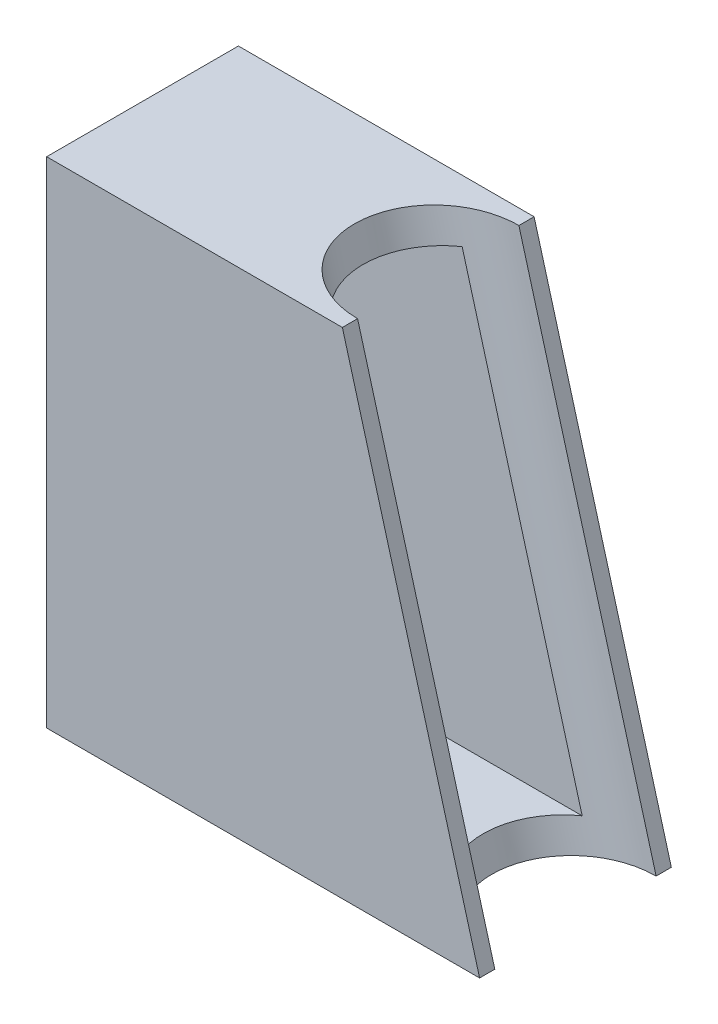
ISO-10303-21;
HEADER;
FILE_DESCRIPTION(('STEP AP214'),'2;1');
FILE_NAME('part.step','',(''),(''),'','','');
FILE_SCHEMA(('AUTOMOTIVE_DESIGN { 1 0 10303 214 1 1 1 1 }'));
ENDSEC;
DATA;
#1=APPLICATION_CONTEXT('core data for automotive mechanical design processes');
#2=APPLICATION_PROTOCOL_DEFINITION('international standard','automotive_design',2000,#1);
#3=PRODUCT_CONTEXT('',#1,'mechanical');
#4=PRODUCT('Part','Part','',(#3));
#5=PRODUCT_RELATED_PRODUCT_CATEGORY('part','',(#4));
#6=PRODUCT_DEFINITION_FORMATION('','',#4);
#7=PRODUCT_DEFINITION_CONTEXT('part definition',#1,'design');
#8=PRODUCT_DEFINITION('design','',#6,#7);
#9=PRODUCT_DEFINITION_SHAPE('','',#8);
#10=(LENGTH_UNIT() NAMED_UNIT(*) SI_UNIT(.MILLI.,.METRE.));
#11=(NAMED_UNIT(*) PLANE_ANGLE_UNIT() SI_UNIT($,.RADIAN.));
#12=(NAMED_UNIT(*) SI_UNIT($,.STERADIAN.) SOLID_ANGLE_UNIT());
#13=UNCERTAINTY_MEASURE_WITH_UNIT(LENGTH_MEASURE(1.E-05),#10,'distance_accuracy_value','');
#14=(GEOMETRIC_REPRESENTATION_CONTEXT(3) GLOBAL_UNCERTAINTY_ASSIGNED_CONTEXT((#13)) GLOBAL_UNIT_ASSIGNED_CONTEXT((#10,
#11,#12)) REPRESENTATION_CONTEXT('',''));
#15=CARTESIAN_POINT('',(0.,0.,0.));
#16=DIRECTION('',(0.,0.,1.));
#17=DIRECTION('',(1.,0.,0.));
#18=AXIS2_PLACEMENT_3D('',#15,#16,#17);
#19=CARTESIAN_POINT('',(-5.55237226107326,-65.915590084916,31.));
#20=DIRECTION('',(-0.963624069203044,-0.267261394991058,0.));
#21=DIRECTION('',(0.267261394991058,-0.963624069203044,0.));
#22=AXIS2_PLACEMENT_3D('',#19,#20,#21);
#23=PLANE('',#22);
#24=DIRECTION('',(0.,0.,-1.));
#25=VECTOR('',#24,1.);
#26=CARTESIAN_POINT('',(-5.55237226107326,-65.915590084916,31.));
#27=LINE('',#26,#25);
#28=CARTESIAN_POINT('',(-5.55237226107326,-65.915590084916,31.));
#29=VERTEX_POINT('',#28);
#30=CARTESIAN_POINT('',(-5.55237226107325,-65.915590084916,28.5414448701443));
#31=VERTEX_POINT('',#30);
#32=EDGE_CURVE('E122',#29,#31,#27,.T.);
#33=ORIENTED_EDGE('',*,*,#32,.T.);
#34=DIRECTION('',(-0.267261394991058,0.963624069203044,0.));
#35=VECTOR('',#34,1.);
#36=CARTESIAN_POINT('',(-5.55237226107325,-65.915590084916,28.5414448701443));
#37=LINE('',#36,#35);
#38=CARTESIAN_POINT('',(-27.7403937962426,14.084409915084,28.5414448701443));
#39=VERTEX_POINT('',#38);
#40=EDGE_CURVE('E110',#31,#39,#37,.T.);
#41=ORIENTED_EDGE('',*,*,#40,.T.);
#42=DIRECTION('',(0.,0.,1.));
#43=VECTOR('',#42,1.);
#44=CARTESIAN_POINT('',(-27.7403937962426,14.084409915084,31.));
#45=LINE('',#44,#43);
#46=CARTESIAN_POINT('',(-27.7403937962426,14.084409915084,31.));
#47=VERTEX_POINT('',#46);
#48=EDGE_CURVE('E180',#39,#47,#45,.T.);
#49=ORIENTED_EDGE('',*,*,#48,.T.);
#50=DIRECTION('',(-0.267261394991058,0.963624069203044,0.));
#51=VECTOR('',#50,1.);
#52=CARTESIAN_POINT('',(-5.55237226107326,-65.915590084916,31.));
#53=LINE('',#52,#51);
#54=EDGE_CURVE('E128',#29,#47,#53,.T.);
#55=ORIENTED_EDGE('',*,*,#54,.F.);
#56=EDGE_LOOP('',(#33,#41,#49,#55));
#57=FACE_BOUND('',#56,.T.);
#58=ADVANCED_FACE('F36',(#57),#23,.F.);
#59=CARTESIAN_POINT('',(-5.55237226107326,-65.915590084916,31.));
#60=DIRECTION('',(0.,1.,0.));
#61=DIRECTION('',(-1.,0.,0.));
#62=AXIS2_PLACEMENT_3D('',#59,#60,#61);
#63=PLANE('',#62);
#64=CARTESIAN_POINT('',(-60.5523722610733,-65.915590084916,14.6496389415134));
#65=DIRECTION('',(0.,1.,0.));
#66=DIRECTION('',(-1.,0.,0.));
#67=AXIS2_PLACEMENT_3D('',#64,#65,#66);
#68=CIRCLE('',#67,6.);
#69=CARTESIAN_POINT('',(-66.5523722610733,-65.915590084916,14.6496389415134));
#70=VERTEX_POINT('',#69);
#71=EDGE_CURVE('E168',#70,#70,#68,.T.);
#72=ORIENTED_EDGE('',*,*,#71,.T.);
#73=EDGE_LOOP('',(#72));
#74=FACE_BOUND('',#73,.T.);
#75=CARTESIAN_POINT('',(-5.55237226107325,-65.915590084916,2.45855512985571));
#76=VERTEX_POINT('',#75);
#77=CARTESIAN_POINT('',(-5.55237226107326,-65.915590084916,0.));
#78=VERTEX_POINT('',#77);
#79=EDGE_CURVE('E124',#76,#78,#27,.T.);
#80=ORIENTED_EDGE('',*,*,#79,.F.);
#81=CARTESIAN_POINT('',(-5.55237226107324,-65.915590084916,15.5));
#82=DIRECTION('',(0.,1.,0.));
#83=DIRECTION('',(-1.,0.,0.));
#84=AXIS2_PLACEMENT_3D('',#81,#82,#83);
#85=ELLIPSE('',#84,13.5337475338594,13.0414448701443);
#86=EDGE_CURVE('E113',#76,#31,#85,.T.);
#87=ORIENTED_EDGE('',*,*,#86,.T.);
#88=ORIENTED_EDGE('',*,*,#32,.F.);
#89=DIRECTION('',(1.,0.,0.));
#90=VECTOR('',#89,1.);
#91=CARTESIAN_POINT('',(-5.55237226107326,-65.915590084916,31.));
#92=LINE('',#91,#90);
#93=CARTESIAN_POINT('',(-75.5523722610733,-65.915590084916,31.));
#94=VERTEX_POINT('',#93);
#95=EDGE_CURVE('E139',#94,#29,#92,.T.);
#96=ORIENTED_EDGE('',*,*,#95,.F.);
#97=DIRECTION('',(0.,0.,-1.));
#98=VECTOR('',#97,1.);
#99=CARTESIAN_POINT('',(-75.5523722610733,-65.915590084916,31.));
#100=LINE('',#99,#98);
#101=CARTESIAN_POINT('',(-75.5523722610733,-65.915590084916,0.));
#102=VERTEX_POINT('',#101);
#103=EDGE_CURVE('E132',#94,#102,#100,.T.);
#104=ORIENTED_EDGE('',*,*,#103,.T.);
#105=DIRECTION('',(1.,0.,0.));
#106=VECTOR('',#105,1.);
#107=CARTESIAN_POINT('',(-5.55237226107326,-65.915590084916,0.));
#108=LINE('',#107,#106);
#109=EDGE_CURVE('E143',#102,#78,#108,.T.);
#110=ORIENTED_EDGE('',*,*,#109,.T.);
#111=EDGE_LOOP('',(#80,#87,#88,#96,#104,#110));
#112=FACE_BOUND('',#111,.T.);
#113=ADVANCED_FACE('F38',(#74,#112),#63,.F.);
#114=CARTESIAN_POINT('',(-27.7403937962426,14.084409915084,0.));
#115=VERTEX_POINT('',#114);
#116=CARTESIAN_POINT('',(-27.7403937962426,14.084409915084,2.45855512985571));
#117=VERTEX_POINT('',#116);
#118=EDGE_CURVE('E177',#115,#117,#45,.T.);
#119=ORIENTED_EDGE('',*,*,#118,.T.);
#120=DIRECTION('',(-0.267261394991058,0.963624069203044,0.));
#121=VECTOR('',#120,1.);
#122=CARTESIAN_POINT('',(-5.55237226107325,-65.915590084916,2.45855512985571));
#123=LINE('',#122,#121);
#124=EDGE_CURVE('E59',#117,#76,#123,.F.);
#125=ORIENTED_EDGE('',*,*,#124,.T.);
#126=ORIENTED_EDGE('',*,*,#79,.T.);
#127=DIRECTION('',(-0.267261394991058,0.963624069203044,0.));
#128=VECTOR('',#127,1.);
#129=CARTESIAN_POINT('',(-5.55237226107326,-65.915590084916,0.));
#130=LINE('',#129,#128);
#131=EDGE_CURVE('E140',#78,#115,#130,.T.);
#132=ORIENTED_EDGE('',*,*,#131,.T.);
#133=EDGE_LOOP('',(#119,#125,#126,#132));
#134=FACE_BOUND('',#133,.T.);
#135=ADVANCED_FACE('F192',(#134),#23,.F.);
#136=CARTESIAN_POINT('',(-75.5523722610733,34.084409915084,31.));
#137=DIRECTION('',(1.,0.,0.));
#138=DIRECTION('',(0.,0.,-1.));
#139=AXIS2_PLACEMENT_3D('',#136,#137,#138);
#140=PLANE('',#139);
#141=DIRECTION('',(0.,0.,1.));
#142=VECTOR('',#141,1.);
#143=CARTESIAN_POINT('',(-75.5523722610733,-60.915590084916,5.00000000000001));
#144=LINE('',#143,#142);
#145=CARTESIAN_POINT('',(-75.5523722610733,-60.915590084916,5.00000000000001));
#146=VERTEX_POINT('',#145);
#147=CARTESIAN_POINT('',(-75.5523722610733,-60.915590084916,26.));
#148=VERTEX_POINT('',#147);
#149=EDGE_CURVE('E162',#146,#148,#144,.T.);
#150=ORIENTED_EDGE('',*,*,#149,.F.);
#151=DIRECTION('',(0.,-1.,0.));
#152=VECTOR('',#151,1.);
#153=CARTESIAN_POINT('',(-75.5523722610733,9.08440991508402,5.));
#154=LINE('',#153,#152);
#155=CARTESIAN_POINT('',(-75.5523722610733,9.08440991508402,5.));
#156=VERTEX_POINT('',#155);
#157=EDGE_CURVE('E165',#156,#146,#154,.T.);
#158=ORIENTED_EDGE('',*,*,#157,.F.);
#159=DIRECTION('',(0.,0.,-1.));
#160=VECTOR('',#159,1.);
#161=CARTESIAN_POINT('',(-75.5523722610733,9.08440991508402,5.));
#162=LINE('',#161,#160);
#163=CARTESIAN_POINT('',(-75.5523722610733,9.08440991508402,26.));
#164=VERTEX_POINT('',#163);
#165=EDGE_CURVE('E152',#164,#156,#162,.T.);
#166=ORIENTED_EDGE('',*,*,#165,.F.);
#167=DIRECTION('',(0.,1.,0.));
#168=VECTOR('',#167,1.);
#169=CARTESIAN_POINT('',(-75.5523722610733,9.08440991508402,26.));
#170=LINE('',#169,#168);
#171=EDGE_CURVE('E159',#148,#164,#170,.T.);
#172=ORIENTED_EDGE('',*,*,#171,.F.);
#173=EDGE_LOOP('',(#150,#158,#166,#172));
#174=FACE_BOUND('',#173,.T.);
#175=DIRECTION('',(0.,-1.,0.));
#176=VECTOR('',#175,1.);
#177=CARTESIAN_POINT('',(-75.5523722610733,34.084409915084,31.));
#178=LINE('',#177,#176);
#179=CARTESIAN_POINT('',(-75.5523722610733,14.084409915084,31.));
#180=VERTEX_POINT('',#179);
#181=EDGE_CURVE('E136',#180,#94,#178,.T.);
#182=ORIENTED_EDGE('',*,*,#181,.F.);
#183=DIRECTION('',(0.,0.,1.));
#184=VECTOR('',#183,1.);
#185=CARTESIAN_POINT('',(-75.5523722610733,14.084409915084,-21.0430808616771));
#186=LINE('',#185,#184);
#187=CARTESIAN_POINT('',(-75.5523722610733,14.084409915084,0.));
#188=VERTEX_POINT('',#187);
#189=EDGE_CURVE('E181',#188,#180,#186,.T.);
#190=ORIENTED_EDGE('',*,*,#189,.F.);
#191=DIRECTION('',(0.,-1.,0.));
#192=VECTOR('',#191,1.);
#193=CARTESIAN_POINT('',(-75.5523722610733,34.084409915084,0.));
#194=LINE('',#193,#192);
#195=EDGE_CURVE('E137',#188,#102,#194,.T.);
#196=ORIENTED_EDGE('',*,*,#195,.T.);
#197=ORIENTED_EDGE('',*,*,#103,.F.);
#198=EDGE_LOOP('',(#182,#190,#196,#197));
#199=FACE_BOUND('',#198,.T.);
#200=ADVANCED_FACE('F204',(#174,#199),#140,.F.);
#201=CARTESIAN_POINT('',(0.,0.,31.));
#202=DIRECTION('',(0.,0.,1.));
#203=DIRECTION('',(1.,0.,0.));
#204=AXIS2_PLACEMENT_3D('',#201,#202,#203);
#205=PLANE('',#204);
#206=DIRECTION('',(1.,0.,0.));
#207=VECTOR('',#206,1.);
#208=CARTESIAN_POINT('',(0.,14.084409915084,31.));
#209=LINE('',#208,#207);
#210=EDGE_CURVE('E174',#180,#47,#209,.T.);
#211=ORIENTED_EDGE('',*,*,#210,.F.);
#212=ORIENTED_EDGE('',*,*,#181,.T.);
#213=ORIENTED_EDGE('',*,*,#95,.T.);
#214=ORIENTED_EDGE('',*,*,#54,.T.);
#215=EDGE_LOOP('',(#211,#212,#213,#214));
#216=FACE_BOUND('',#215,.T.);
#217=ADVANCED_FACE('F207',(#216),#205,.T.);
#218=CARTESIAN_POINT('',(0.,0.,0.));
#219=DIRECTION('',(0.,0.,1.));
#220=DIRECTION('',(1.,0.,0.));
#221=AXIS2_PLACEMENT_3D('',#218,#219,#220);
#222=PLANE('',#221);
#223=ORIENTED_EDGE('',*,*,#195,.F.);
#224=DIRECTION('',(1.,0.,0.));
#225=VECTOR('',#224,1.);
#226=CARTESIAN_POINT('',(0.,14.084409915084,0.));
#227=LINE('',#226,#225);
#228=EDGE_CURVE('E44',#188,#115,#227,.T.);
#229=ORIENTED_EDGE('',*,*,#228,.T.);
#230=ORIENTED_EDGE('',*,*,#131,.F.);
#231=ORIENTED_EDGE('',*,*,#109,.F.);
#232=EDGE_LOOP('',(#223,#229,#230,#231));
#233=FACE_BOUND('',#232,.T.);
#234=ADVANCED_FACE('F199',(#233),#222,.F.);
#235=CARTESIAN_POINT('',(34.4476277389267,9.08440991508402,5.));
#236=DIRECTION('',(0.,0.,-1.));
#237=DIRECTION('',(0.,1.,0.));
#238=AXIS2_PLACEMENT_3D('',#235,#236,#237);
#239=PLANE('',#238);
#240=DIRECTION('',(-1.,0.,0.));
#241=VECTOR('',#240,1.);
#242=CARTESIAN_POINT('',(34.4476277389267,-60.915590084916,5.00000000000001));
#243=LINE('',#242,#241);
#244=CARTESIAN_POINT('',(-14.9660497071633,-60.915590084916,5.00000000000001));
#245=VERTEX_POINT('',#244);
#246=EDGE_CURVE('E149',#245,#146,#243,.T.);
#247=ORIENTED_EDGE('',*,*,#246,.F.);
#248=DIRECTION('',(-0.267261394991058,0.963624069203044,0.));
#249=VECTOR('',#248,1.);
#250=CARTESIAN_POINT('',(-13.0059458401242,-67.9828407234904,5.00000000000001));
#251=LINE('',#250,#249);
#252=CARTESIAN_POINT('',(-34.3805685504365,9.08440991508402,5.));
#253=VERTEX_POINT('',#252);
#254=EDGE_CURVE('E51',#245,#253,#251,.T.);
#255=ORIENTED_EDGE('',*,*,#254,.T.);
#256=DIRECTION('',(-1.,0.,0.));
#257=VECTOR('',#256,1.);
#258=CARTESIAN_POINT('',(34.4476277389267,9.08440991508402,5.));
#259=LINE('',#258,#257);
#260=EDGE_CURVE('E145',#253,#156,#259,.T.);
#261=ORIENTED_EDGE('',*,*,#260,.T.);
#262=ORIENTED_EDGE('',*,*,#157,.T.);
#263=EDGE_LOOP('',(#247,#255,#261,#262));
#264=FACE_BOUND('',#263,.T.);
#265=ADVANCED_FACE('F214',(#264),#239,.F.);
#266=CARTESIAN_POINT('',(34.4476277389267,9.08440991508402,5.));
#267=DIRECTION('',(0.,1.,0.));
#268=DIRECTION('',(0.,0.,1.));
#269=AXIS2_PLACEMENT_3D('',#266,#267,#268);
#270=PLANE('',#269);
#271=ORIENTED_EDGE('',*,*,#260,.F.);
#272=CARTESIAN_POINT('',(-26.3536424502945,9.08440991508401,15.5));
#273=DIRECTION('',(0.,1.,0.));
#274=DIRECTION('',(-1.,0.,0.));
#275=AXIS2_PLACEMENT_3D('',#272,#273,#274);
#276=ELLIPSE('',#275,13.5337475338594,13.0414448701443);
#277=CARTESIAN_POINT('',(-34.3805685504364,9.084409915084,26.));
#278=VERTEX_POINT('',#277);
#279=EDGE_CURVE('E184',#253,#278,#276,.T.);
#280=ORIENTED_EDGE('',*,*,#279,.T.);
#281=DIRECTION('',(-1.,0.,0.));
#282=VECTOR('',#281,1.);
#283=CARTESIAN_POINT('',(34.4476277389267,9.08440991508402,26.));
#284=LINE('',#283,#282);
#285=EDGE_CURVE('E154',#278,#164,#284,.T.);
#286=ORIENTED_EDGE('',*,*,#285,.T.);
#287=ORIENTED_EDGE('',*,*,#165,.T.);
#288=EDGE_LOOP('',(#271,#280,#286,#287));
#289=FACE_BOUND('',#288,.T.);
#290=ADVANCED_FACE('F297',(#289),#270,.F.);
#291=CARTESIAN_POINT('',(34.4476277389267,9.08440991508402,26.));
#292=DIRECTION('',(0.,0.,1.));
#293=DIRECTION('',(0.,-1.,0.));
#294=AXIS2_PLACEMENT_3D('',#291,#292,#293);
#295=PLANE('',#294);
#296=ORIENTED_EDGE('',*,*,#285,.F.);
#297=DIRECTION('',(-0.267261394991058,0.963624069203044,0.));
#298=VECTOR('',#297,1.);
#299=CARTESIAN_POINT('',(-13.0059458401242,-67.9828407234904,26.));
#300=LINE('',#299,#298);
#301=CARTESIAN_POINT('',(-14.9660497071633,-60.915590084916,26.));
#302=VERTEX_POINT('',#301);
#303=EDGE_CURVE('E187',#278,#302,#300,.F.);
#304=ORIENTED_EDGE('',*,*,#303,.T.);
#305=DIRECTION('',(-1.,0.,0.));
#306=VECTOR('',#305,1.);
#307=CARTESIAN_POINT('',(34.4476277389267,-60.915590084916,26.));
#308=LINE('',#307,#306);
#309=EDGE_CURVE('E151',#302,#148,#308,.T.);
#310=ORIENTED_EDGE('',*,*,#309,.T.);
#311=ORIENTED_EDGE('',*,*,#171,.T.);
#312=EDGE_LOOP('',(#296,#304,#310,#311));
#313=FACE_BOUND('',#312,.T.);
#314=ADVANCED_FACE('F287',(#313),#295,.F.);
#315=CARTESIAN_POINT('',(34.4476277389267,-60.915590084916,5.00000000000001));
#316=DIRECTION('',(0.,-1.,0.));
#317=DIRECTION('',(0.,0.,-1.));
#318=AXIS2_PLACEMENT_3D('',#315,#316,#317);
#319=PLANE('',#318);
#320=CARTESIAN_POINT('',(-60.5523722610733,-60.915590084916,14.6496389415134));
#321=DIRECTION('',(0.,1.,0.));
#322=DIRECTION('',(0.,0.,1.));
#323=AXIS2_PLACEMENT_3D('',#320,#321,#322);
#324=CIRCLE('',#323,6.);
#325=CARTESIAN_POINT('',(-60.5523722610733,-60.915590084916,20.6496389415134));
#326=VERTEX_POINT('',#325);
#327=EDGE_CURVE('E171',#326,#326,#324,.T.);
#328=ORIENTED_EDGE('',*,*,#327,.F.);
#329=EDGE_LOOP('',(#328));
#330=FACE_BOUND('',#329,.T.);
#331=ORIENTED_EDGE('',*,*,#309,.F.);
#332=CARTESIAN_POINT('',(-6.93912360702132,-60.915590084916,15.5));
#333=DIRECTION('',(0.,-1.,0.));
#334=DIRECTION('',(-1.,0.,0.));
#335=AXIS2_PLACEMENT_3D('',#332,#333,#334);
#336=ELLIPSE('',#335,13.5337475338594,13.0414448701443);
#337=EDGE_CURVE('E125',#302,#245,#336,.T.);
#338=ORIENTED_EDGE('',*,*,#337,.T.);
#339=ORIENTED_EDGE('',*,*,#246,.T.);
#340=ORIENTED_EDGE('',*,*,#149,.T.);
#341=EDGE_LOOP('',(#331,#338,#339,#340));
#342=FACE_BOUND('',#341,.T.);
#343=ADVANCED_FACE('F282',(#330,#342),#319,.F.);
#344=CARTESIAN_POINT('',(-60.5523722610733,-170.915590084916,14.6496389415133));
#345=DIRECTION('',(0.,1.,0.));
#346=DIRECTION('',(0.,0.,1.));
#347=AXIS2_PLACEMENT_3D('',#344,#345,#346);
#348=CYLINDRICAL_SURFACE('',#347,6.);
#349=ORIENTED_EDGE('',*,*,#327,.T.);
#350=EDGE_LOOP('',(#349));
#351=FACE_BOUND('',#350,.T.);
#352=ORIENTED_EDGE('',*,*,#71,.F.);
#353=EDGE_LOOP('',(#352));
#354=FACE_BOUND('',#353,.T.);
#355=ADVANCED_FACE('F240',(#351,#354),#348,.F.);
#356=CARTESIAN_POINT('',(34.4476277389267,14.084409915084,-21.0430808616771));
#357=DIRECTION('',(0.,-1.,0.));
#358=DIRECTION('',(0.,0.,-1.));
#359=AXIS2_PLACEMENT_3D('',#356,#357,#358);
#360=PLANE('',#359);
#361=ORIENTED_EDGE('',*,*,#48,.F.);
#362=CARTESIAN_POINT('',(-27.7403937962426,14.084409915084,15.5));
#363=DIRECTION('',(0.,-1.,0.));
#364=DIRECTION('',(-1.,0.,0.));
#365=AXIS2_PLACEMENT_3D('',#362,#363,#364);
#366=ELLIPSE('',#365,13.5337475338594,13.0414448701443);
#367=EDGE_CURVE('E11',#39,#117,#366,.T.);
#368=ORIENTED_EDGE('',*,*,#367,.T.);
#369=ORIENTED_EDGE('',*,*,#118,.F.);
#370=ORIENTED_EDGE('',*,*,#228,.F.);
#371=ORIENTED_EDGE('',*,*,#189,.T.);
#372=ORIENTED_EDGE('',*,*,#210,.T.);
#373=EDGE_LOOP('',(#361,#368,#369,#370,#371,#372));
#374=FACE_BOUND('',#373,.T.);
#375=ADVANCED_FACE('F195',(#374),#360,.F.);
#376=CARTESIAN_POINT('',(-5.55237226107323,-65.915590084916,15.5));
#377=DIRECTION('',(-0.267261394991058,0.963624069203044,0.));
#378=DIRECTION('',(-0.963624069203044,-0.267261394991058,0.));
#379=AXIS2_PLACEMENT_3D('',#376,#377,#378);
#380=CYLINDRICAL_SURFACE('',#379,13.0414448701443);
#381=ORIENTED_EDGE('',*,*,#124,.F.);
#382=ORIENTED_EDGE('',*,*,#367,.F.);
#383=ORIENTED_EDGE('',*,*,#40,.F.);
#384=ORIENTED_EDGE('',*,*,#86,.F.);
#385=EDGE_LOOP('',(#381,#382,#383,#384));
#386=FACE_BOUND('',#385,.T.);
#387=ORIENTED_EDGE('',*,*,#337,.F.);
#388=ORIENTED_EDGE('',*,*,#303,.F.);
#389=ORIENTED_EDGE('',*,*,#279,.F.);
#390=ORIENTED_EDGE('',*,*,#254,.F.);
#391=EDGE_LOOP('',(#387,#388,#389,#390));
#392=FACE_BOUND('',#391,.T.);
#393=ADVANCED_FACE('F112',(#386,#392),#380,.F.);
#394=CLOSED_SHELL('',(#58,#113,#135,#200,#217,#234,#265,#290,#314,#343,#355,#375,#393));
#395=MANIFOLD_SOLID_BREP('B2',#394);
#396=ADVANCED_BREP_SHAPE_REPRESENTATION('',(#18,#395),#14);
#397=SHAPE_DEFINITION_REPRESENTATION(#9,#396);
ENDSEC;
END-ISO-10303-21;
